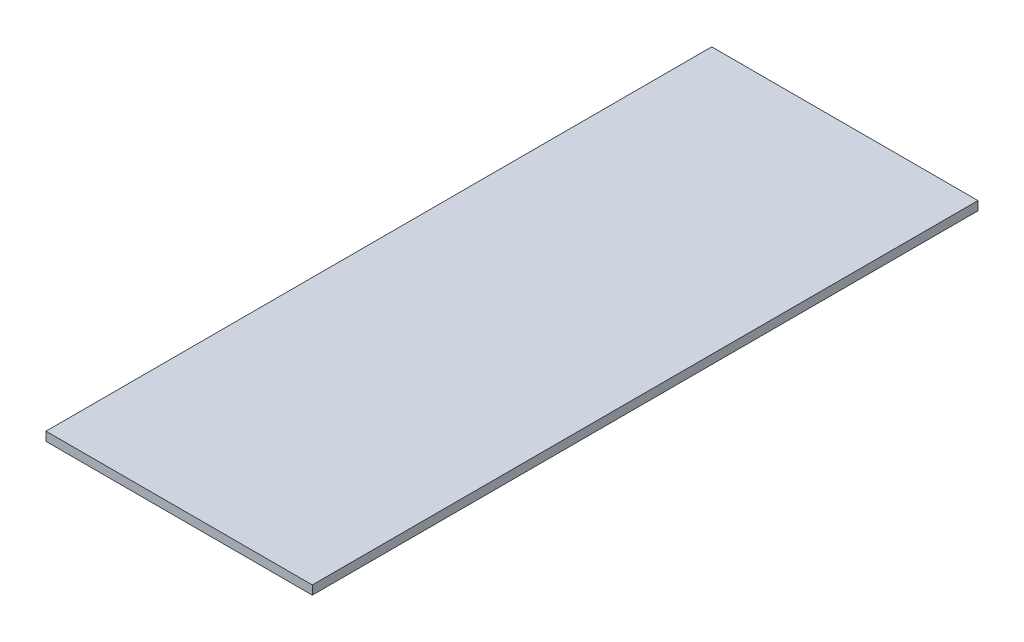
ISO-10303-21;
HEADER;
FILE_DESCRIPTION(('STEP AP214'),'2;1');
FILE_NAME('part.step','',(''),(''),'','','');
FILE_SCHEMA(('AUTOMOTIVE_DESIGN { 1 0 10303 214 1 1 1 1 }'));
ENDSEC;
DATA;
#1=APPLICATION_CONTEXT('core data for automotive mechanical design processes');
#2=APPLICATION_PROTOCOL_DEFINITION('international standard','automotive_design',2000,#1);
#3=PRODUCT_CONTEXT('',#1,'mechanical');
#4=PRODUCT('Part','Part','',(#3));
#5=PRODUCT_RELATED_PRODUCT_CATEGORY('part','',(#4));
#6=PRODUCT_DEFINITION_FORMATION('','',#4);
#7=PRODUCT_DEFINITION_CONTEXT('part definition',#1,'design');
#8=PRODUCT_DEFINITION('design','',#6,#7);
#9=PRODUCT_DEFINITION_SHAPE('','',#8);
#10=(LENGTH_UNIT() NAMED_UNIT(*) SI_UNIT(.MILLI.,.METRE.));
#11=(NAMED_UNIT(*) PLANE_ANGLE_UNIT() SI_UNIT($,.RADIAN.));
#12=(NAMED_UNIT(*) SI_UNIT($,.STERADIAN.) SOLID_ANGLE_UNIT());
#13=UNCERTAINTY_MEASURE_WITH_UNIT(LENGTH_MEASURE(1.E-05),#10,'distance_accuracy_value','');
#14=(GEOMETRIC_REPRESENTATION_CONTEXT(3) GLOBAL_UNCERTAINTY_ASSIGNED_CONTEXT((#13)) GLOBAL_UNIT_ASSIGNED_CONTEXT((#10,
#11,#12)) REPRESENTATION_CONTEXT('',''));
#15=CARTESIAN_POINT('',(0.,0.,0.));
#16=DIRECTION('',(0.,0.,1.));
#17=DIRECTION('',(1.,0.,0.));
#18=AXIS2_PLACEMENT_3D('',#15,#16,#17);
#19=CARTESIAN_POINT('',(150.,10.,-375.));
#20=DIRECTION('',(-1.,0.,0.));
#21=DIRECTION('',(0.,0.,1.));
#22=AXIS2_PLACEMENT_3D('',#19,#20,#21);
#23=PLANE('',#22);
#24=DIRECTION('',(0.,0.,-1.));
#25=VECTOR('',#24,1.);
#26=CARTESIAN_POINT('',(150.,0.,-375.));
#27=LINE('',#26,#25);
#28=CARTESIAN_POINT('',(150.,0.,375.));
#29=VERTEX_POINT('',#28);
#30=CARTESIAN_POINT('',(150.,0.,-375.));
#31=VERTEX_POINT('',#30);
#32=EDGE_CURVE('E111',#29,#31,#27,.T.);
#33=ORIENTED_EDGE('',*,*,#32,.T.);
#34=DIRECTION('',(0.,-1.,0.));
#35=VECTOR('',#34,1.);
#36=CARTESIAN_POINT('',(150.,10.,-375.));
#37=LINE('',#36,#35);
#38=CARTESIAN_POINT('',(150.,10.,-375.));
#39=VERTEX_POINT('',#38);
#40=EDGE_CURVE('E11',#39,#31,#37,.T.);
#41=ORIENTED_EDGE('',*,*,#40,.F.);
#42=DIRECTION('',(0.,0.,-1.));
#43=VECTOR('',#42,1.);
#44=CARTESIAN_POINT('',(150.,10.,-375.));
#45=LINE('',#44,#43);
#46=CARTESIAN_POINT('',(150.,10.,375.));
#47=VERTEX_POINT('',#46);
#48=EDGE_CURVE('E95',#47,#39,#45,.T.);
#49=ORIENTED_EDGE('',*,*,#48,.F.);
#50=DIRECTION('',(0.,-1.,0.));
#51=VECTOR('',#50,1.);
#52=CARTESIAN_POINT('',(150.,10.,375.));
#53=LINE('',#52,#51);
#54=EDGE_CURVE('E107',#47,#29,#53,.T.);
#55=ORIENTED_EDGE('',*,*,#54,.T.);
#56=EDGE_LOOP('',(#33,#41,#49,#55));
#57=FACE_BOUND('',#56,.T.);
#58=ADVANCED_FACE('F43',(#57),#23,.F.);
#59=CARTESIAN_POINT('',(-150.,10.,-375.));
#60=DIRECTION('',(0.,0.,1.));
#61=DIRECTION('',(1.,0.,0.));
#62=AXIS2_PLACEMENT_3D('',#59,#60,#61);
#63=PLANE('',#62);
#64=DIRECTION('',(-1.,0.,0.));
#65=VECTOR('',#64,1.);
#66=CARTESIAN_POINT('',(-150.,0.,-375.));
#67=LINE('',#66,#65);
#68=CARTESIAN_POINT('',(-150.,0.,-375.));
#69=VERTEX_POINT('',#68);
#70=EDGE_CURVE('E100',#31,#69,#67,.T.);
#71=ORIENTED_EDGE('',*,*,#70,.T.);
#72=DIRECTION('',(0.,-1.,0.));
#73=VECTOR('',#72,1.);
#74=CARTESIAN_POINT('',(-150.,10.,-375.));
#75=LINE('',#74,#73);
#76=CARTESIAN_POINT('',(-150.,10.,-375.));
#77=VERTEX_POINT('',#76);
#78=EDGE_CURVE('E52',#77,#69,#75,.T.);
#79=ORIENTED_EDGE('',*,*,#78,.F.);
#80=DIRECTION('',(-1.,0.,0.));
#81=VECTOR('',#80,1.);
#82=CARTESIAN_POINT('',(-150.,10.,-375.));
#83=LINE('',#82,#81);
#84=EDGE_CURVE('E90',#39,#77,#83,.T.);
#85=ORIENTED_EDGE('',*,*,#84,.F.);
#86=ORIENTED_EDGE('',*,*,#40,.T.);
#87=EDGE_LOOP('',(#71,#79,#85,#86));
#88=FACE_BOUND('',#87,.T.);
#89=ADVANCED_FACE('F99',(#88),#63,.F.);
#90=CARTESIAN_POINT('',(-150.,10.,-375.));
#91=DIRECTION('',(1.,0.,0.));
#92=DIRECTION('',(0.,0.,-1.));
#93=AXIS2_PLACEMENT_3D('',#90,#91,#92);
#94=PLANE('',#93);
#95=DIRECTION('',(0.,0.,1.));
#96=VECTOR('',#95,1.);
#97=CARTESIAN_POINT('',(-150.,0.,-375.));
#98=LINE('',#97,#96);
#99=CARTESIAN_POINT('',(-150.,0.,375.));
#100=VERTEX_POINT('',#99);
#101=EDGE_CURVE('E77',#69,#100,#98,.T.);
#102=ORIENTED_EDGE('',*,*,#101,.T.);
#103=DIRECTION('',(0.,-1.,0.));
#104=VECTOR('',#103,1.);
#105=CARTESIAN_POINT('',(-150.,10.,375.));
#106=LINE('',#105,#104);
#107=CARTESIAN_POINT('',(-150.,10.,375.));
#108=VERTEX_POINT('',#107);
#109=EDGE_CURVE('E102',#108,#100,#106,.T.);
#110=ORIENTED_EDGE('',*,*,#109,.F.);
#111=DIRECTION('',(0.,0.,1.));
#112=VECTOR('',#111,1.);
#113=CARTESIAN_POINT('',(-150.,10.,-375.));
#114=LINE('',#113,#112);
#115=EDGE_CURVE('E93',#77,#108,#114,.T.);
#116=ORIENTED_EDGE('',*,*,#115,.F.);
#117=ORIENTED_EDGE('',*,*,#78,.T.);
#118=EDGE_LOOP('',(#102,#110,#116,#117));
#119=FACE_BOUND('',#118,.T.);
#120=ADVANCED_FACE('F103',(#119),#94,.F.);
#121=CARTESIAN_POINT('',(-150.,10.,375.));
#122=DIRECTION('',(0.,0.,-1.));
#123=DIRECTION('',(-1.,0.,0.));
#124=AXIS2_PLACEMENT_3D('',#121,#122,#123);
#125=PLANE('',#124);
#126=DIRECTION('',(1.,0.,0.));
#127=VECTOR('',#126,1.);
#128=CARTESIAN_POINT('',(-150.,0.,375.));
#129=LINE('',#128,#127);
#130=EDGE_CURVE('E83',#100,#29,#129,.T.);
#131=ORIENTED_EDGE('',*,*,#130,.T.);
#132=ORIENTED_EDGE('',*,*,#54,.F.);
#133=DIRECTION('',(1.,0.,0.));
#134=VECTOR('',#133,1.);
#135=CARTESIAN_POINT('',(-150.,10.,375.));
#136=LINE('',#135,#134);
#137=EDGE_CURVE('E60',#108,#47,#136,.T.);
#138=ORIENTED_EDGE('',*,*,#137,.F.);
#139=ORIENTED_EDGE('',*,*,#109,.T.);
#140=EDGE_LOOP('',(#131,#132,#138,#139));
#141=FACE_BOUND('',#140,.T.);
#142=ADVANCED_FACE('F124',(#141),#125,.F.);
#143=CARTESIAN_POINT('',(0.,10.,0.));
#144=DIRECTION('',(0.,1.,0.));
#145=DIRECTION('',(0.,0.,1.));
#146=AXIS2_PLACEMENT_3D('',#143,#144,#145);
#147=PLANE('',#146);
#148=ORIENTED_EDGE('',*,*,#48,.T.);
#149=ORIENTED_EDGE('',*,*,#84,.T.);
#150=ORIENTED_EDGE('',*,*,#115,.T.);
#151=ORIENTED_EDGE('',*,*,#137,.T.);
#152=EDGE_LOOP('',(#148,#149,#150,#151));
#153=FACE_BOUND('',#152,.T.);
#154=ADVANCED_FACE('F91',(#153),#147,.T.);
#155=CARTESIAN_POINT('',(0.,0.,0.));
#156=DIRECTION('',(0.,1.,0.));
#157=DIRECTION('',(0.,0.,1.));
#158=AXIS2_PLACEMENT_3D('',#155,#156,#157);
#159=PLANE('',#158);
#160=ORIENTED_EDGE('',*,*,#32,.F.);
#161=ORIENTED_EDGE('',*,*,#130,.F.);
#162=ORIENTED_EDGE('',*,*,#101,.F.);
#163=ORIENTED_EDGE('',*,*,#70,.F.);
#164=EDGE_LOOP('',(#160,#161,#162,#163));
#165=FACE_BOUND('',#164,.T.);
#166=ADVANCED_FACE('F127',(#165),#159,.F.);
#167=CLOSED_SHELL('',(#58,#89,#120,#142,#154,#166));
#168=MANIFOLD_SOLID_BREP('B2',#167);
#169=ADVANCED_BREP_SHAPE_REPRESENTATION('',(#18,#168),#14);
#170=SHAPE_DEFINITION_REPRESENTATION(#9,#169);
ENDSEC;
END-ISO-10303-21;
